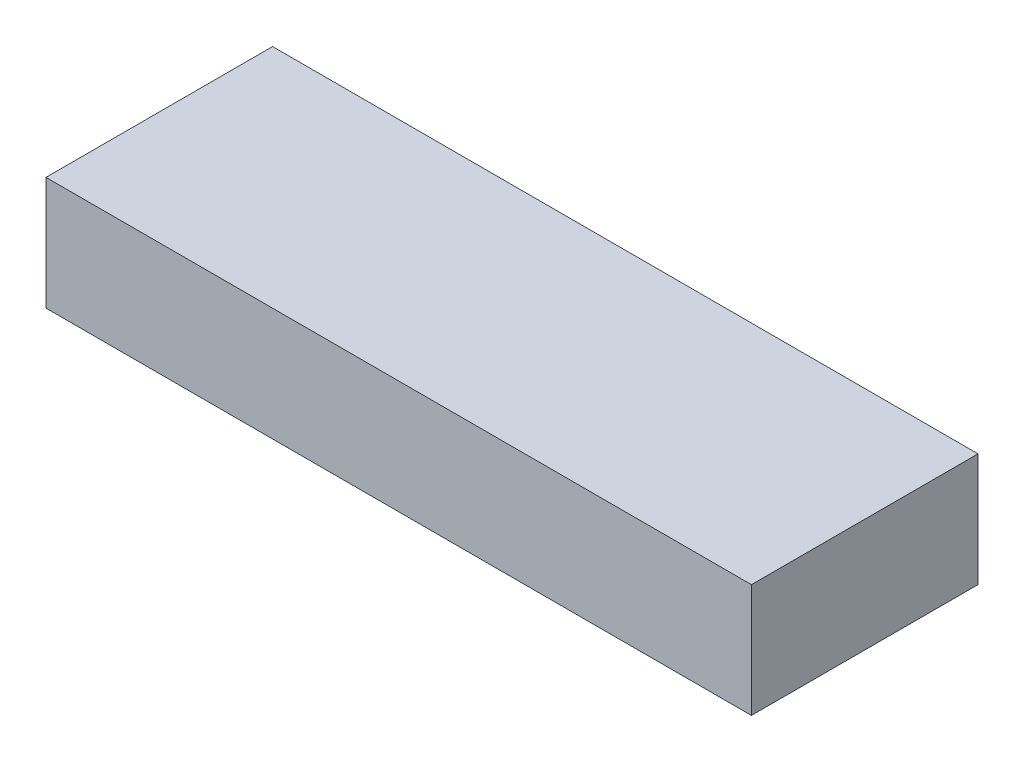
ISO-10303-21;
HEADER;
FILE_DESCRIPTION(('STEP AP214'),'2;1');
FILE_NAME('part.step','',(''),(''),'','','');
FILE_SCHEMA(('AUTOMOTIVE_DESIGN { 1 0 10303 214 1 1 1 1 }'));
ENDSEC;
DATA;
#1=APPLICATION_CONTEXT('core data for automotive mechanical design processes');
#2=APPLICATION_PROTOCOL_DEFINITION('international standard','automotive_design',2000,#1);
#3=PRODUCT_CONTEXT('',#1,'mechanical');
#4=PRODUCT('Part','Part','',(#3));
#5=PRODUCT_RELATED_PRODUCT_CATEGORY('part','',(#4));
#6=PRODUCT_DEFINITION_FORMATION('','',#4);
#7=PRODUCT_DEFINITION_CONTEXT('part definition',#1,'design');
#8=PRODUCT_DEFINITION('design','',#6,#7);
#9=PRODUCT_DEFINITION_SHAPE('','',#8);
#10=(LENGTH_UNIT() NAMED_UNIT(*) SI_UNIT(.MILLI.,.METRE.));
#11=(NAMED_UNIT(*) PLANE_ANGLE_UNIT() SI_UNIT($,.RADIAN.));
#12=(NAMED_UNIT(*) SI_UNIT($,.STERADIAN.) SOLID_ANGLE_UNIT());
#13=UNCERTAINTY_MEASURE_WITH_UNIT(LENGTH_MEASURE(1.E-05),#10,'distance_accuracy_value','');
#14=(GEOMETRIC_REPRESENTATION_CONTEXT(3) GLOBAL_UNCERTAINTY_ASSIGNED_CONTEXT((#13)) GLOBAL_UNIT_ASSIGNED_CONTEXT((#10,
#11,#12)) REPRESENTATION_CONTEXT('',''));
#15=CARTESIAN_POINT('',(0.,0.,0.));
#16=DIRECTION('',(0.,0.,1.));
#17=DIRECTION('',(1.,0.,0.));
#18=AXIS2_PLACEMENT_3D('',#15,#16,#17);
#19=CARTESIAN_POINT('',(-59.6911970159829,22.,-26.543532290086));
#20=DIRECTION('',(1.,0.,0.));
#21=DIRECTION('',(0.,0.,-1.));
#22=AXIS2_PLACEMENT_3D('',#19,#20,#21);
#23=PLANE('',#22);
#24=DIRECTION('',(0.,0.,1.));
#25=VECTOR('',#24,1.);
#26=CARTESIAN_POINT('',(-59.6911970159829,0.,-26.543532290086));
#27=LINE('',#26,#25);
#28=CARTESIAN_POINT('',(-59.6911970159829,0.,-26.543532290086));
#29=VERTEX_POINT('',#28);
#30=CARTESIAN_POINT('',(-59.6911970159829,0.,17.456467709914));
#31=VERTEX_POINT('',#30);
#32=EDGE_CURVE('E97',#29,#31,#27,.T.);
#33=ORIENTED_EDGE('',*,*,#32,.T.);
#34=DIRECTION('',(0.,-1.,0.));
#35=VECTOR('',#34,1.);
#36=CARTESIAN_POINT('',(-59.6911970159829,22.,17.456467709914));
#37=LINE('',#36,#35);
#38=CARTESIAN_POINT('',(-59.6911970159829,22.,17.456467709914));
#39=VERTEX_POINT('',#38);
#40=EDGE_CURVE('E11',#39,#31,#37,.T.);
#41=ORIENTED_EDGE('',*,*,#40,.F.);
#42=DIRECTION('',(0.,0.,1.));
#43=VECTOR('',#42,1.);
#44=CARTESIAN_POINT('',(-59.6911970159829,22.,-26.543532290086));
#45=LINE('',#44,#43);
#46=CARTESIAN_POINT('',(-59.6911970159829,22.,-26.543532290086));
#47=VERTEX_POINT('',#46);
#48=EDGE_CURVE('E85',#47,#39,#45,.T.);
#49=ORIENTED_EDGE('',*,*,#48,.F.);
#50=DIRECTION('',(0.,-1.,0.));
#51=VECTOR('',#50,1.);
#52=CARTESIAN_POINT('',(-59.6911970159829,22.,-26.543532290086));
#53=LINE('',#52,#51);
#54=EDGE_CURVE('E93',#47,#29,#53,.T.);
#55=ORIENTED_EDGE('',*,*,#54,.T.);
#56=EDGE_LOOP('',(#33,#41,#49,#55));
#57=FACE_BOUND('',#56,.T.);
#58=ADVANCED_FACE('F34',(#57),#23,.F.);
#59=CARTESIAN_POINT('',(-59.6911970159829,22.,17.456467709914));
#60=DIRECTION('',(0.,0.,-1.));
#61=DIRECTION('',(-1.,0.,0.));
#62=AXIS2_PLACEMENT_3D('',#59,#60,#61);
#63=PLANE('',#62);
#64=DIRECTION('',(1.,0.,0.));
#65=VECTOR('',#64,1.);
#66=CARTESIAN_POINT('',(-59.6911970159829,0.,17.456467709914));
#67=LINE('',#66,#65);
#68=CARTESIAN_POINT('',(77.3088029840171,0.,17.456467709914));
#69=VERTEX_POINT('',#68);
#70=EDGE_CURVE('E89',#31,#69,#67,.T.);
#71=ORIENTED_EDGE('',*,*,#70,.T.);
#72=DIRECTION('',(0.,-1.,0.));
#73=VECTOR('',#72,1.);
#74=CARTESIAN_POINT('',(77.3088029840171,22.,17.456467709914));
#75=LINE('',#74,#73);
#76=CARTESIAN_POINT('',(77.3088029840171,22.,17.456467709914));
#77=VERTEX_POINT('',#76);
#78=EDGE_CURVE('E42',#77,#69,#75,.T.);
#79=ORIENTED_EDGE('',*,*,#78,.F.);
#80=DIRECTION('',(1.,0.,0.));
#81=VECTOR('',#80,1.);
#82=CARTESIAN_POINT('',(-59.6911970159829,22.,17.456467709914));
#83=LINE('',#82,#81);
#84=EDGE_CURVE('E80',#39,#77,#83,.T.);
#85=ORIENTED_EDGE('',*,*,#84,.F.);
#86=ORIENTED_EDGE('',*,*,#40,.T.);
#87=EDGE_LOOP('',(#71,#79,#85,#86));
#88=FACE_BOUND('',#87,.T.);
#89=ADVANCED_FACE('F88',(#88),#63,.F.);
#90=CARTESIAN_POINT('',(77.3088029840171,22.,-26.543532290086));
#91=DIRECTION('',(-1.,0.,0.));
#92=DIRECTION('',(0.,0.,1.));
#93=AXIS2_PLACEMENT_3D('',#90,#91,#92);
#94=PLANE('',#93);
#95=DIRECTION('',(0.,0.,-1.));
#96=VECTOR('',#95,1.);
#97=CARTESIAN_POINT('',(77.3088029840171,0.,-26.543532290086));
#98=LINE('',#97,#96);
#99=CARTESIAN_POINT('',(77.3088029840171,0.,-26.543532290086));
#100=VERTEX_POINT('',#99);
#101=EDGE_CURVE('E67',#69,#100,#98,.T.);
#102=ORIENTED_EDGE('',*,*,#101,.T.);
#103=DIRECTION('',(0.,-1.,0.));
#104=VECTOR('',#103,1.);
#105=CARTESIAN_POINT('',(77.3088029840171,22.,-26.543532290086));
#106=LINE('',#105,#104);
#107=CARTESIAN_POINT('',(77.3088029840171,22.,-26.543532290086));
#108=VERTEX_POINT('',#107);
#109=EDGE_CURVE('E90',#108,#100,#106,.T.);
#110=ORIENTED_EDGE('',*,*,#109,.F.);
#111=DIRECTION('',(0.,0.,-1.));
#112=VECTOR('',#111,1.);
#113=CARTESIAN_POINT('',(77.3088029840171,22.,-26.543532290086));
#114=LINE('',#113,#112);
#115=EDGE_CURVE('E83',#77,#108,#114,.T.);
#116=ORIENTED_EDGE('',*,*,#115,.F.);
#117=ORIENTED_EDGE('',*,*,#78,.T.);
#118=EDGE_LOOP('',(#102,#110,#116,#117));
#119=FACE_BOUND('',#118,.T.);
#120=ADVANCED_FACE('F91',(#119),#94,.F.);
#121=CARTESIAN_POINT('',(-59.6911970159829,22.,-26.543532290086));
#122=DIRECTION('',(0.,0.,1.));
#123=DIRECTION('',(1.,0.,0.));
#124=AXIS2_PLACEMENT_3D('',#121,#122,#123);
#125=PLANE('',#124);
#126=DIRECTION('',(-1.,0.,0.));
#127=VECTOR('',#126,1.);
#128=CARTESIAN_POINT('',(-59.6911970159829,0.,-26.543532290086));
#129=LINE('',#128,#127);
#130=EDGE_CURVE('E73',#100,#29,#129,.T.);
#131=ORIENTED_EDGE('',*,*,#130,.T.);
#132=ORIENTED_EDGE('',*,*,#54,.F.);
#133=DIRECTION('',(-1.,0.,0.));
#134=VECTOR('',#133,1.);
#135=CARTESIAN_POINT('',(-59.6911970159829,22.,-26.543532290086));
#136=LINE('',#135,#134);
#137=EDGE_CURVE('E50',#108,#47,#136,.T.);
#138=ORIENTED_EDGE('',*,*,#137,.F.);
#139=ORIENTED_EDGE('',*,*,#109,.T.);
#140=EDGE_LOOP('',(#131,#132,#138,#139));
#141=FACE_BOUND('',#140,.T.);
#142=ADVANCED_FACE('F104',(#141),#125,.F.);
#143=CARTESIAN_POINT('',(0.,22.,0.));
#144=DIRECTION('',(0.,1.,0.));
#145=DIRECTION('',(0.,0.,1.));
#146=AXIS2_PLACEMENT_3D('',#143,#144,#145);
#147=PLANE('',#146);
#148=ORIENTED_EDGE('',*,*,#48,.T.);
#149=ORIENTED_EDGE('',*,*,#84,.T.);
#150=ORIENTED_EDGE('',*,*,#115,.T.);
#151=ORIENTED_EDGE('',*,*,#137,.T.);
#152=EDGE_LOOP('',(#148,#149,#150,#151));
#153=FACE_BOUND('',#152,.T.);
#154=ADVANCED_FACE('F81',(#153),#147,.T.);
#155=CARTESIAN_POINT('',(0.,0.,0.));
#156=DIRECTION('',(0.,1.,0.));
#157=DIRECTION('',(0.,0.,1.));
#158=AXIS2_PLACEMENT_3D('',#155,#156,#157);
#159=PLANE('',#158);
#160=ORIENTED_EDGE('',*,*,#32,.F.);
#161=ORIENTED_EDGE('',*,*,#130,.F.);
#162=ORIENTED_EDGE('',*,*,#101,.F.);
#163=ORIENTED_EDGE('',*,*,#70,.F.);
#164=EDGE_LOOP('',(#160,#161,#162,#163));
#165=FACE_BOUND('',#164,.T.);
#166=ADVANCED_FACE('F107',(#165),#159,.F.);
#167=CLOSED_SHELL('',(#58,#89,#120,#142,#154,#166));
#168=MANIFOLD_SOLID_BREP('B2',#167);
#169=ADVANCED_BREP_SHAPE_REPRESENTATION('',(#18,#168),#14);
#170=SHAPE_DEFINITION_REPRESENTATION(#9,#169);
ENDSEC;
END-ISO-10303-21;
